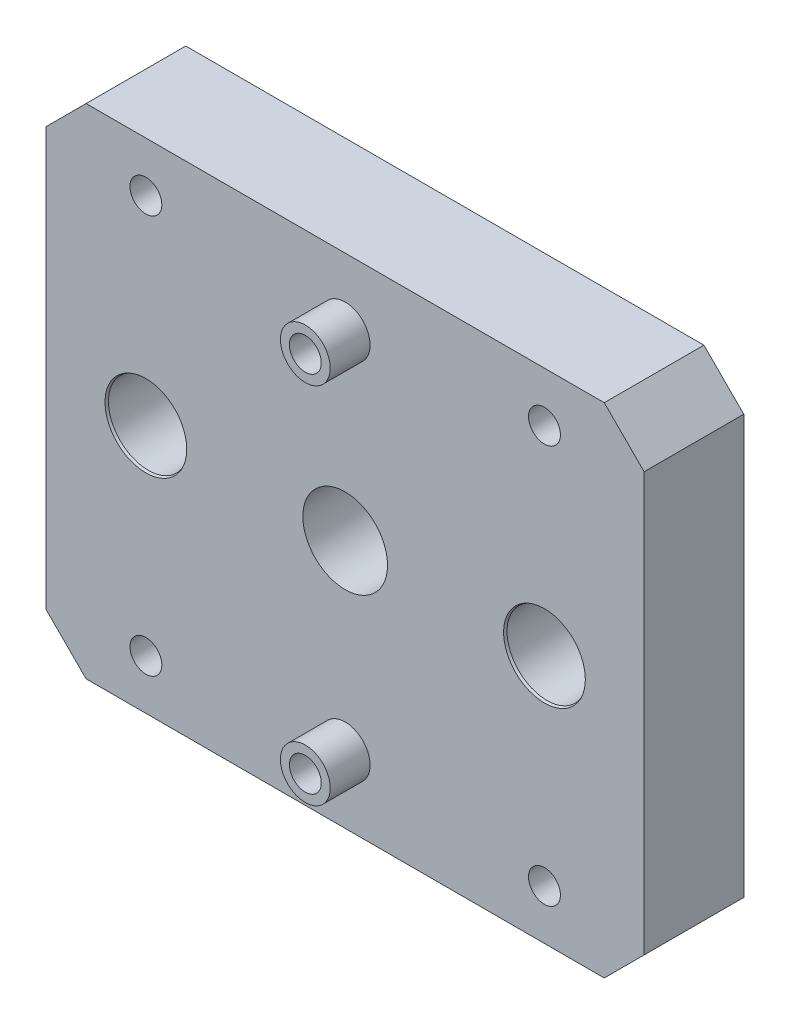
ISO-10303-21;
HEADER;
FILE_DESCRIPTION(('STEP AP214'),'2;1');
FILE_NAME('part.step','',(''),(''),'','','');
FILE_SCHEMA(('AUTOMOTIVE_DESIGN { 1 0 10303 214 1 1 1 1 }'));
ENDSEC;
DATA;
#1=APPLICATION_CONTEXT('core data for automotive mechanical design processes');
#2=APPLICATION_PROTOCOL_DEFINITION('international standard','automotive_design',2000,#1);
#3=PRODUCT_CONTEXT('',#1,'mechanical');
#4=PRODUCT('Part','Part','',(#3));
#5=PRODUCT_RELATED_PRODUCT_CATEGORY('part','',(#4));
#6=PRODUCT_DEFINITION_FORMATION('','',#4);
#7=PRODUCT_DEFINITION_CONTEXT('part definition',#1,'design');
#8=PRODUCT_DEFINITION('design','',#6,#7);
#9=PRODUCT_DEFINITION_SHAPE('','',#8);
#10=(LENGTH_UNIT() NAMED_UNIT(*) SI_UNIT(.MILLI.,.METRE.));
#11=(NAMED_UNIT(*) PLANE_ANGLE_UNIT() SI_UNIT($,.RADIAN.));
#12=(NAMED_UNIT(*) SI_UNIT($,.STERADIAN.) SOLID_ANGLE_UNIT());
#13=UNCERTAINTY_MEASURE_WITH_UNIT(LENGTH_MEASURE(1.E-05),#10,'distance_accuracy_value','');
#14=(GEOMETRIC_REPRESENTATION_CONTEXT(3) GLOBAL_UNCERTAINTY_ASSIGNED_CONTEXT((#13)) GLOBAL_UNIT_ASSIGNED_CONTEXT((#10,
#11,#12)) REPRESENTATION_CONTEXT('',''));
#15=CARTESIAN_POINT('',(0.,0.,0.));
#16=DIRECTION('',(0.,0.,1.));
#17=DIRECTION('',(1.,0.,0.));
#18=AXIS2_PLACEMENT_3D('',#15,#16,#17);
#19=CARTESIAN_POINT('',(0.,0.,10.));
#20=DIRECTION('',(0.,0.,-1.));
#21=DIRECTION('',(-1.,0.,0.));
#22=AXIS2_PLACEMENT_3D('',#19,#20,#21);
#23=PLANE('',#22);
#24=CARTESIAN_POINT('',(20.,-20.0000000000002,10.));
#25=DIRECTION('',(0.,0.,1.));
#26=DIRECTION('',(1.,0.,0.));
#27=AXIS2_PLACEMENT_3D('',#24,#25,#26);
#28=CIRCLE('',#27,1.6);
#29=CARTESIAN_POINT('',(21.6,-20.0000000000002,10.));
#30=VERTEX_POINT('',#29);
#31=EDGE_CURVE('E244',#30,#30,#28,.T.);
#32=ORIENTED_EDGE('',*,*,#31,.F.);
#33=EDGE_LOOP('',(#32));
#34=FACE_BOUND('',#33,.T.);
#35=CARTESIAN_POINT('',(-20.,20.0000000000002,10.));
#36=DIRECTION('',(0.,0.,1.));
#37=DIRECTION('',(1.,0.,0.));
#38=AXIS2_PLACEMENT_3D('',#35,#36,#37);
#39=CIRCLE('',#38,1.6);
#40=CARTESIAN_POINT('',(-18.4,20.0000000000002,10.));
#41=VERTEX_POINT('',#40);
#42=EDGE_CURVE('E229',#41,#41,#39,.T.);
#43=ORIENTED_EDGE('',*,*,#42,.F.);
#44=EDGE_LOOP('',(#43));
#45=FACE_BOUND('',#44,.T.);
#46=CARTESIAN_POINT('',(0.,-18.25,10.));
#47=DIRECTION('',(0.,0.,-1.));
#48=DIRECTION('',(-1.,0.,0.));
#49=AXIS2_PLACEMENT_3D('',#46,#47,#48);
#50=CIRCLE('',#49,2.5);
#51=CARTESIAN_POINT('',(-2.5,-18.25,10.));
#52=VERTEX_POINT('',#51);
#53=EDGE_CURVE('E149',#52,#52,#50,.F.);
#54=ORIENTED_EDGE('',*,*,#53,.F.);
#55=EDGE_LOOP('',(#54));
#56=FACE_BOUND('',#55,.T.);
#57=CARTESIAN_POINT('',(0.,18.25,10.));
#58=DIRECTION('',(0.,0.,-1.));
#59=DIRECTION('',(-1.,0.,0.));
#60=AXIS2_PLACEMENT_3D('',#57,#58,#59);
#61=CIRCLE('',#60,2.5);
#62=CARTESIAN_POINT('',(-2.5,18.25,10.));
#63=VERTEX_POINT('',#62);
#64=EDGE_CURVE('E146',#63,#63,#61,.F.);
#65=ORIENTED_EDGE('',*,*,#64,.F.);
#66=EDGE_LOOP('',(#65));
#67=FACE_BOUND('',#66,.T.);
#68=CARTESIAN_POINT('',(20.,0.,10.));
#69=DIRECTION('',(0.,0.,1.));
#70=DIRECTION('',(1.,0.,0.));
#71=AXIS2_PLACEMENT_3D('',#68,#69,#70);
#72=CIRCLE('',#71,4.1);
#73=CARTESIAN_POINT('',(24.1,0.,10.));
#74=VERTEX_POINT('',#73);
#75=EDGE_CURVE('E207',#74,#74,#72,.T.);
#76=ORIENTED_EDGE('',*,*,#75,.F.);
#77=EDGE_LOOP('',(#76));
#78=FACE_BOUND('',#77,.T.);
#79=CARTESIAN_POINT('',(-20.,0.,10.));
#80=DIRECTION('',(0.,0.,1.));
#81=DIRECTION('',(1.,0.,0.));
#82=AXIS2_PLACEMENT_3D('',#79,#80,#81);
#83=CIRCLE('',#82,4.1);
#84=CARTESIAN_POINT('',(-15.9,0.,10.));
#85=VERTEX_POINT('',#84);
#86=EDGE_CURVE('E198',#85,#85,#83,.T.);
#87=ORIENTED_EDGE('',*,*,#86,.F.);
#88=EDGE_LOOP('',(#87));
#89=FACE_BOUND('',#88,.T.);
#90=CARTESIAN_POINT('',(0.,0.,10.));
#91=DIRECTION('',(0.,0.,1.));
#92=DIRECTION('',(1.,0.,0.));
#93=AXIS2_PLACEMENT_3D('',#90,#91,#92);
#94=CIRCLE('',#93,4.25000000000002);
#95=CARTESIAN_POINT('',(4.25000000000002,0.,10.));
#96=VERTEX_POINT('',#95);
#97=EDGE_CURVE('E137',#96,#96,#94,.T.);
#98=ORIENTED_EDGE('',*,*,#97,.F.);
#99=EDGE_LOOP('',(#98));
#100=FACE_BOUND('',#99,.T.);
#101=DIRECTION('',(1.,0.,0.));
#102=VECTOR('',#101,1.);
#103=CARTESIAN_POINT('',(-30.,-25.,10.));
#104=LINE('',#103,#102);
#105=CARTESIAN_POINT('',(-26.,-25.,10.));
#106=VERTEX_POINT('',#105);
#107=CARTESIAN_POINT('',(26.,-25.,10.));
#108=VERTEX_POINT('',#107);
#109=EDGE_CURVE('E140',#106,#108,#104,.T.);
#110=ORIENTED_EDGE('',*,*,#109,.T.);
#111=DIRECTION('',(-0.707106781186549,-0.707106781186546,0.));
#112=VECTOR('',#111,1.);
#113=CARTESIAN_POINT('',(30.,-21.,10.));
#114=LINE('',#113,#112);
#115=CARTESIAN_POINT('',(30.,-21.,10.));
#116=VERTEX_POINT('',#115);
#117=EDGE_CURVE('E165',#108,#116,#114,.F.);
#118=ORIENTED_EDGE('',*,*,#117,.T.);
#119=DIRECTION('',(0.,1.,0.));
#120=VECTOR('',#119,1.);
#121=CARTESIAN_POINT('',(30.,-25.,10.));
#122=LINE('',#121,#120);
#123=CARTESIAN_POINT('',(30.,21.,10.));
#124=VERTEX_POINT('',#123);
#125=EDGE_CURVE('E123',#116,#124,#122,.T.);
#126=ORIENTED_EDGE('',*,*,#125,.T.);
#127=DIRECTION('',(0.707106781186546,-0.707106781186549,0.));
#128=VECTOR('',#127,1.);
#129=CARTESIAN_POINT('',(26.,25.,10.));
#130=LINE('',#129,#128);
#131=CARTESIAN_POINT('',(26.,25.,10.));
#132=VERTEX_POINT('',#131);
#133=EDGE_CURVE('E160',#124,#132,#130,.F.);
#134=ORIENTED_EDGE('',*,*,#133,.T.);
#135=DIRECTION('',(-1.,0.,0.));
#136=VECTOR('',#135,1.);
#137=CARTESIAN_POINT('',(-30.,25.,10.));
#138=LINE('',#137,#136);
#139=CARTESIAN_POINT('',(-26.,25.,10.));
#140=VERTEX_POINT('',#139);
#141=EDGE_CURVE('E176',#132,#140,#138,.T.);
#142=ORIENTED_EDGE('',*,*,#141,.T.);
#143=DIRECTION('',(0.707106781186549,0.707106781186546,0.));
#144=VECTOR('',#143,1.);
#145=CARTESIAN_POINT('',(-30.,21.,10.));
#146=LINE('',#145,#144);
#147=CARTESIAN_POINT('',(-30.,21.,10.));
#148=VERTEX_POINT('',#147);
#149=EDGE_CURVE('E59',#140,#148,#146,.F.);
#150=ORIENTED_EDGE('',*,*,#149,.T.);
#151=DIRECTION('',(0.,-1.,0.));
#152=VECTOR('',#151,1.);
#153=CARTESIAN_POINT('',(-30.,-25.,10.));
#154=LINE('',#153,#152);
#155=CARTESIAN_POINT('',(-30.,-21.,10.));
#156=VERTEX_POINT('',#155);
#157=EDGE_CURVE('E184',#148,#156,#154,.T.);
#158=ORIENTED_EDGE('',*,*,#157,.T.);
#159=DIRECTION('',(-0.707106781186546,0.707106781186549,0.));
#160=VECTOR('',#159,1.);
#161=CARTESIAN_POINT('',(-26.,-25.,10.));
#162=LINE('',#161,#160);
#163=EDGE_CURVE('E163',#156,#106,#162,.F.);
#164=ORIENTED_EDGE('',*,*,#163,.T.);
#165=EDGE_LOOP('',(#110,#118,#126,#134,#142,#150,#158,#164));
#166=FACE_BOUND('',#165,.T.);
#167=CARTESIAN_POINT('',(20.,20.0000000000002,10.));
#168=DIRECTION('',(0.,0.,1.));
#169=DIRECTION('',(1.,0.,0.));
#170=AXIS2_PLACEMENT_3D('',#167,#168,#169);
#171=CIRCLE('',#170,1.6);
#172=CARTESIAN_POINT('',(21.6,20.0000000000002,10.));
#173=VERTEX_POINT('',#172);
#174=EDGE_CURVE('E232',#173,#173,#171,.F.);
#175=ORIENTED_EDGE('',*,*,#174,.T.);
#176=EDGE_LOOP('',(#175));
#177=FACE_BOUND('',#176,.T.);
#178=CARTESIAN_POINT('',(-20.,-20.0000000000002,10.));
#179=DIRECTION('',(0.,0.,-1.));
#180=DIRECTION('',(-1.,0.,0.));
#181=AXIS2_PLACEMENT_3D('',#178,#179,#180);
#182=CIRCLE('',#181,1.6);
#183=CARTESIAN_POINT('',(-21.6,-20.0000000000002,10.));
#184=VERTEX_POINT('',#183);
#185=EDGE_CURVE('E238',#184,#184,#182,.T.);
#186=ORIENTED_EDGE('',*,*,#185,.T.);
#187=EDGE_LOOP('',(#186));
#188=FACE_BOUND('',#187,.T.);
#189=ADVANCED_FACE('F36',(#34,#45,#56,#67,#78,#89,#100,#166,#177,#188),#23,.F.);
#190=CARTESIAN_POINT('',(0.,0.,0.));
#191=DIRECTION('',(0.,0.,-1.));
#192=DIRECTION('',(-1.,0.,0.));
#193=AXIS2_PLACEMENT_3D('',#190,#191,#192);
#194=PLANE('',#193);
#195=CARTESIAN_POINT('',(20.,20.0000000000002,0.));
#196=DIRECTION('',(0.,0.,1.));
#197=DIRECTION('',(1.,0.,0.));
#198=AXIS2_PLACEMENT_3D('',#195,#196,#197);
#199=CIRCLE('',#198,1.6);
#200=CARTESIAN_POINT('',(21.6,20.0000000000002,0.));
#201=VERTEX_POINT('',#200);
#202=EDGE_CURVE('E247',#201,#201,#199,.F.);
#203=ORIENTED_EDGE('',*,*,#202,.F.);
#204=EDGE_LOOP('',(#203));
#205=FACE_BOUND('',#204,.T.);
#206=CARTESIAN_POINT('',(-20.,20.0000000000002,0.));
#207=DIRECTION('',(0.,0.,1.));
#208=DIRECTION('',(1.,0.,0.));
#209=AXIS2_PLACEMENT_3D('',#206,#207,#208);
#210=CIRCLE('',#209,1.6);
#211=CARTESIAN_POINT('',(-18.4,20.0000000000002,0.));
#212=VERTEX_POINT('',#211);
#213=EDGE_CURVE('E228',#212,#212,#210,.T.);
#214=ORIENTED_EDGE('',*,*,#213,.T.);
#215=EDGE_LOOP('',(#214));
#216=FACE_BOUND('',#215,.T.);
#217=CARTESIAN_POINT('',(0.,18.25,0.));
#218=DIRECTION('',(0.,0.,1.));
#219=DIRECTION('',(1.,0.,0.));
#220=AXIS2_PLACEMENT_3D('',#217,#218,#219);
#221=CIRCLE('',#220,1.60000000000001);
#222=CARTESIAN_POINT('',(1.60000000000001,18.25,0.));
#223=VERTEX_POINT('',#222);
#224=EDGE_CURVE('E222',#223,#223,#221,.T.);
#225=ORIENTED_EDGE('',*,*,#224,.T.);
#226=EDGE_LOOP('',(#225));
#227=FACE_BOUND('',#226,.T.);
#228=CARTESIAN_POINT('',(0.,-18.25,0.));
#229=DIRECTION('',(0.,0.,1.));
#230=DIRECTION('',(1.,0.,0.));
#231=AXIS2_PLACEMENT_3D('',#228,#229,#230);
#232=CIRCLE('',#231,1.60000000000001);
#233=CARTESIAN_POINT('',(1.60000000000001,-18.25,0.));
#234=VERTEX_POINT('',#233);
#235=EDGE_CURVE('E216',#234,#234,#232,.T.);
#236=ORIENTED_EDGE('',*,*,#235,.T.);
#237=EDGE_LOOP('',(#236));
#238=FACE_BOUND('',#237,.T.);
#239=CARTESIAN_POINT('',(20.,0.,0.));
#240=DIRECTION('',(0.,0.,1.));
#241=DIRECTION('',(1.,0.,0.));
#242=AXIS2_PLACEMENT_3D('',#239,#240,#241);
#243=CIRCLE('',#242,4.);
#244=CARTESIAN_POINT('',(24.,0.,0.));
#245=VERTEX_POINT('',#244);
#246=EDGE_CURVE('E201',#245,#245,#243,.T.);
#247=ORIENTED_EDGE('',*,*,#246,.T.);
#248=EDGE_LOOP('',(#247));
#249=FACE_BOUND('',#248,.T.);
#250=CARTESIAN_POINT('',(-20.,0.,0.));
#251=DIRECTION('',(0.,0.,1.));
#252=DIRECTION('',(1.,0.,0.));
#253=AXIS2_PLACEMENT_3D('',#250,#251,#252);
#254=CIRCLE('',#253,4.);
#255=CARTESIAN_POINT('',(-16.,0.,0.));
#256=VERTEX_POINT('',#255);
#257=EDGE_CURVE('E192',#256,#256,#254,.T.);
#258=ORIENTED_EDGE('',*,*,#257,.T.);
#259=EDGE_LOOP('',(#258));
#260=FACE_BOUND('',#259,.T.);
#261=CARTESIAN_POINT('',(0.,0.,0.));
#262=DIRECTION('',(0.,0.,-1.));
#263=DIRECTION('',(-1.,0.,0.));
#264=AXIS2_PLACEMENT_3D('',#261,#262,#263);
#265=CIRCLE('',#264,4.25000000000001);
#266=CARTESIAN_POINT('',(-4.25000000000001,0.,0.));
#267=VERTEX_POINT('',#266);
#268=EDGE_CURVE('E131',#267,#267,#265,.T.);
#269=ORIENTED_EDGE('',*,*,#268,.F.);
#270=EDGE_LOOP('',(#269));
#271=FACE_BOUND('',#270,.T.);
#272=DIRECTION('',(0.,1.,0.));
#273=VECTOR('',#272,1.);
#274=CARTESIAN_POINT('',(30.,-25.,0.));
#275=LINE('',#274,#273);
#276=CARTESIAN_POINT('',(30.,-21.,0.));
#277=VERTEX_POINT('',#276);
#278=CARTESIAN_POINT('',(30.,21.,0.));
#279=VERTEX_POINT('',#278);
#280=EDGE_CURVE('E120',#277,#279,#275,.T.);
#281=ORIENTED_EDGE('',*,*,#280,.F.);
#282=DIRECTION('',(0.707106781186549,0.707106781186546,0.));
#283=VECTOR('',#282,1.);
#284=CARTESIAN_POINT('',(25.4999999999999,-25.5,0.));
#285=LINE('',#284,#283);
#286=CARTESIAN_POINT('',(26.,-25.,0.));
#287=VERTEX_POINT('',#286);
#288=EDGE_CURVE('E103',#277,#287,#285,.F.);
#289=ORIENTED_EDGE('',*,*,#288,.T.);
#290=DIRECTION('',(1.,0.,0.));
#291=VECTOR('',#290,1.);
#292=CARTESIAN_POINT('',(-30.,-25.,0.));
#293=LINE('',#292,#291);
#294=CARTESIAN_POINT('',(-26.,-25.,0.));
#295=VERTEX_POINT('',#294);
#296=EDGE_CURVE('E144',#295,#287,#293,.T.);
#297=ORIENTED_EDGE('',*,*,#296,.F.);
#298=DIRECTION('',(0.707106781186546,-0.707106781186549,0.));
#299=VECTOR('',#298,1.);
#300=CARTESIAN_POINT('',(-25.5000000000001,-25.5,0.));
#301=LINE('',#300,#299);
#302=CARTESIAN_POINT('',(-30.,-21.,0.));
#303=VERTEX_POINT('',#302);
#304=EDGE_CURVE('E114',#295,#303,#301,.F.);
#305=ORIENTED_EDGE('',*,*,#304,.T.);
#306=DIRECTION('',(0.,-1.,0.));
#307=VECTOR('',#306,1.);
#308=CARTESIAN_POINT('',(-30.,-25.,0.));
#309=LINE('',#308,#307);
#310=CARTESIAN_POINT('',(-30.,21.,0.));
#311=VERTEX_POINT('',#310);
#312=EDGE_CURVE('E134',#311,#303,#309,.T.);
#313=ORIENTED_EDGE('',*,*,#312,.F.);
#314=DIRECTION('',(-0.707106781186549,-0.707106781186546,0.));
#315=VECTOR('',#314,1.);
#316=CARTESIAN_POINT('',(-25.5,25.5,0.));
#317=LINE('',#316,#315);
#318=CARTESIAN_POINT('',(-26.,25.,0.));
#319=VERTEX_POINT('',#318);
#320=EDGE_CURVE('E154',#311,#319,#317,.F.);
#321=ORIENTED_EDGE('',*,*,#320,.T.);
#322=DIRECTION('',(-1.,0.,0.));
#323=VECTOR('',#322,1.);
#324=CARTESIAN_POINT('',(-30.,25.,0.));
#325=LINE('',#324,#323);
#326=CARTESIAN_POINT('',(26.,25.,0.));
#327=VERTEX_POINT('',#326);
#328=EDGE_CURVE('E130',#327,#319,#325,.T.);
#329=ORIENTED_EDGE('',*,*,#328,.F.);
#330=DIRECTION('',(-0.707106781186546,0.707106781186549,0.));
#331=VECTOR('',#330,1.);
#332=CARTESIAN_POINT('',(25.5,25.5,0.));
#333=LINE('',#332,#331);
#334=EDGE_CURVE('E124',#327,#279,#333,.F.);
#335=ORIENTED_EDGE('',*,*,#334,.T.);
#336=EDGE_LOOP('',(#281,#289,#297,#305,#313,#321,#329,#335));
#337=FACE_BOUND('',#336,.T.);
#338=CARTESIAN_POINT('',(20.,-20.0000000000002,0.));
#339=DIRECTION('',(0.,0.,1.));
#340=DIRECTION('',(1.,0.,0.));
#341=AXIS2_PLACEMENT_3D('',#338,#339,#340);
#342=CIRCLE('',#341,1.6);
#343=CARTESIAN_POINT('',(21.6,-20.0000000000002,0.));
#344=VERTEX_POINT('',#343);
#345=EDGE_CURVE('E241',#344,#344,#342,.T.);
#346=ORIENTED_EDGE('',*,*,#345,.T.);
#347=EDGE_LOOP('',(#346));
#348=FACE_BOUND('',#347,.T.);
#349=CARTESIAN_POINT('',(-20.,-20.0000000000002,0.));
#350=DIRECTION('',(0.,0.,-1.));
#351=DIRECTION('',(-1.,0.,0.));
#352=AXIS2_PLACEMENT_3D('',#349,#350,#351);
#353=CIRCLE('',#352,1.6);
#354=CARTESIAN_POINT('',(-21.6,-20.0000000000002,0.));
#355=VERTEX_POINT('',#354);
#356=EDGE_CURVE('E235',#355,#355,#353,.T.);
#357=ORIENTED_EDGE('',*,*,#356,.F.);
#358=EDGE_LOOP('',(#357));
#359=FACE_BOUND('',#358,.T.);
#360=ADVANCED_FACE('F127',(#205,#216,#227,#238,#249,#260,#271,#337,#348,#359),#194,.T.);
#361=CARTESIAN_POINT('',(30.,-25.,10.));
#362=DIRECTION('',(-1.,0.,0.));
#363=DIRECTION('',(0.,0.,1.));
#364=AXIS2_PLACEMENT_3D('',#361,#362,#363);
#365=PLANE('',#364);
#366=ORIENTED_EDGE('',*,*,#125,.F.);
#367=DIRECTION('',(0.,0.,-1.));
#368=VECTOR('',#367,1.);
#369=CARTESIAN_POINT('',(30.,-21.,10.));
#370=LINE('',#369,#368);
#371=EDGE_CURVE('E107',#116,#277,#370,.T.);
#372=ORIENTED_EDGE('',*,*,#371,.T.);
#373=ORIENTED_EDGE('',*,*,#280,.T.);
#374=DIRECTION('',(0.,0.,1.));
#375=VECTOR('',#374,1.);
#376=CARTESIAN_POINT('',(30.,21.,10.));
#377=LINE('',#376,#375);
#378=EDGE_CURVE('E125',#279,#124,#377,.T.);
#379=ORIENTED_EDGE('',*,*,#378,.T.);
#380=EDGE_LOOP('',(#366,#372,#373,#379));
#381=FACE_BOUND('',#380,.T.);
#382=ADVANCED_FACE('F119',(#381),#365,.F.);
#383=CARTESIAN_POINT('',(-30.,25.,10.));
#384=DIRECTION('',(0.,-1.,0.));
#385=DIRECTION('',(0.,0.,-1.));
#386=AXIS2_PLACEMENT_3D('',#383,#384,#385);
#387=PLANE('',#386);
#388=ORIENTED_EDGE('',*,*,#328,.T.);
#389=DIRECTION('',(0.,0.,1.));
#390=VECTOR('',#389,1.);
#391=CARTESIAN_POINT('',(-26.,25.,10.));
#392=LINE('',#391,#390);
#393=EDGE_CURVE('E11',#319,#140,#392,.T.);
#394=ORIENTED_EDGE('',*,*,#393,.T.);
#395=ORIENTED_EDGE('',*,*,#141,.F.);
#396=DIRECTION('',(0.,0.,-1.));
#397=VECTOR('',#396,1.);
#398=CARTESIAN_POINT('',(26.,25.,10.));
#399=LINE('',#398,#397);
#400=EDGE_CURVE('E45',#132,#327,#399,.T.);
#401=ORIENTED_EDGE('',*,*,#400,.T.);
#402=EDGE_LOOP('',(#388,#394,#395,#401));
#403=FACE_BOUND('',#402,.T.);
#404=ADVANCED_FACE('F174',(#403),#387,.F.);
#405=CARTESIAN_POINT('',(-30.,-25.,10.));
#406=DIRECTION('',(1.,0.,0.));
#407=DIRECTION('',(0.,0.,-1.));
#408=AXIS2_PLACEMENT_3D('',#405,#406,#407);
#409=PLANE('',#408);
#410=ORIENTED_EDGE('',*,*,#312,.T.);
#411=DIRECTION('',(0.,0.,1.));
#412=VECTOR('',#411,1.);
#413=CARTESIAN_POINT('',(-30.,-21.,10.));
#414=LINE('',#413,#412);
#415=EDGE_CURVE('E52',#303,#156,#414,.T.);
#416=ORIENTED_EDGE('',*,*,#415,.T.);
#417=ORIENTED_EDGE('',*,*,#157,.F.);
#418=DIRECTION('',(0.,0.,-1.));
#419=VECTOR('',#418,1.);
#420=CARTESIAN_POINT('',(-30.,21.,10.));
#421=LINE('',#420,#419);
#422=EDGE_CURVE('E167',#148,#311,#421,.T.);
#423=ORIENTED_EDGE('',*,*,#422,.T.);
#424=EDGE_LOOP('',(#410,#416,#417,#423));
#425=FACE_BOUND('',#424,.T.);
#426=ADVANCED_FACE('F183',(#425),#409,.F.);
#427=CARTESIAN_POINT('',(-30.,-25.,10.));
#428=DIRECTION('',(0.,1.,0.));
#429=DIRECTION('',(0.,0.,1.));
#430=AXIS2_PLACEMENT_3D('',#427,#428,#429);
#431=PLANE('',#430);
#432=ORIENTED_EDGE('',*,*,#296,.T.);
#433=DIRECTION('',(0.,0.,1.));
#434=VECTOR('',#433,1.);
#435=CARTESIAN_POINT('',(26.,-25.,10.));
#436=LINE('',#435,#434);
#437=EDGE_CURVE('E108',#287,#108,#436,.T.);
#438=ORIENTED_EDGE('',*,*,#437,.T.);
#439=ORIENTED_EDGE('',*,*,#109,.F.);
#440=DIRECTION('',(0.,0.,-1.));
#441=VECTOR('',#440,1.);
#442=CARTESIAN_POINT('',(-26.,-25.,10.));
#443=LINE('',#442,#441);
#444=EDGE_CURVE('E113',#106,#295,#443,.T.);
#445=ORIENTED_EDGE('',*,*,#444,.T.);
#446=EDGE_LOOP('',(#432,#438,#439,#445));
#447=FACE_BOUND('',#446,.T.);
#448=ADVANCED_FACE('F284',(#447),#431,.F.);
#449=CARTESIAN_POINT('',(0.,0.,10.));
#450=DIRECTION('',(0.,0.,1.));
#451=DIRECTION('',(1.,0.,0.));
#452=AXIS2_PLACEMENT_3D('',#449,#450,#451);
#453=CYLINDRICAL_SURFACE('',#452,4.25000000000001);
#454=ORIENTED_EDGE('',*,*,#268,.T.);
#455=EDGE_LOOP('',(#454));
#456=FACE_BOUND('',#455,.T.);
#457=ORIENTED_EDGE('',*,*,#97,.T.);
#458=EDGE_LOOP('',(#457));
#459=FACE_BOUND('',#458,.T.);
#460=ADVANCED_FACE('F281',(#456,#459),#453,.F.);
#461=CARTESIAN_POINT('',(-20.,0.,10.));
#462=DIRECTION('',(0.,0.,1.));
#463=DIRECTION('',(1.,0.,0.));
#464=AXIS2_PLACEMENT_3D('',#461,#462,#463);
#465=CYLINDRICAL_SURFACE('',#464,4.00000000000001);
#466=ORIENTED_EDGE('',*,*,#257,.F.);
#467=EDGE_LOOP('',(#466));
#468=FACE_BOUND('',#467,.T.);
#469=CARTESIAN_POINT('',(-20.,0.,9.75857864376273));
#470=DIRECTION('',(0.,0.,1.));
#471=DIRECTION('',(1.,0.,0.));
#472=AXIS2_PLACEMENT_3D('',#469,#470,#471);
#473=CIRCLE('',#472,4.00000000000001);
#474=CARTESIAN_POINT('',(-16.,0.,9.75857864376273));
#475=VERTEX_POINT('',#474);
#476=EDGE_CURVE('E195',#475,#475,#473,.T.);
#477=ORIENTED_EDGE('',*,*,#476,.T.);
#478=EDGE_LOOP('',(#477));
#479=FACE_BOUND('',#478,.T.);
#480=ADVANCED_FACE('F383',(#468,#479),#465,.F.);
#481=CARTESIAN_POINT('',(-20.,0.,10.));
#482=DIRECTION('',(0.,0.,1.));
#483=DIRECTION('',(1.,0.,0.));
#484=AXIS2_PLACEMENT_3D('',#481,#482,#483);
#485=CONICAL_SURFACE('',#484,4.1,0.392699081698732);
#486=ORIENTED_EDGE('',*,*,#476,.F.);
#487=EDGE_LOOP('',(#486));
#488=FACE_BOUND('',#487,.T.);
#489=ORIENTED_EDGE('',*,*,#86,.T.);
#490=EDGE_LOOP('',(#489));
#491=FACE_BOUND('',#490,.T.);
#492=ADVANCED_FACE('F380',(#488,#491),#485,.F.);
#493=CARTESIAN_POINT('',(20.,0.,10.));
#494=DIRECTION('',(0.,0.,1.));
#495=DIRECTION('',(1.,0.,0.));
#496=AXIS2_PLACEMENT_3D('',#493,#494,#495);
#497=CYLINDRICAL_SURFACE('',#496,4.00000000000001);
#498=ORIENTED_EDGE('',*,*,#246,.F.);
#499=EDGE_LOOP('',(#498));
#500=FACE_BOUND('',#499,.T.);
#501=CARTESIAN_POINT('',(20.,0.,9.75857864376273));
#502=DIRECTION('',(0.,0.,1.));
#503=DIRECTION('',(1.,0.,0.));
#504=AXIS2_PLACEMENT_3D('',#501,#502,#503);
#505=CIRCLE('',#504,4.00000000000001);
#506=CARTESIAN_POINT('',(24.,0.,9.75857864376273));
#507=VERTEX_POINT('',#506);
#508=EDGE_CURVE('E204',#507,#507,#505,.T.);
#509=ORIENTED_EDGE('',*,*,#508,.T.);
#510=EDGE_LOOP('',(#509));
#511=FACE_BOUND('',#510,.T.);
#512=ADVANCED_FACE('F376',(#500,#511),#497,.F.);
#513=CARTESIAN_POINT('',(20.,0.,10.));
#514=DIRECTION('',(0.,0.,1.));
#515=DIRECTION('',(1.,0.,0.));
#516=AXIS2_PLACEMENT_3D('',#513,#514,#515);
#517=CONICAL_SURFACE('',#516,4.1,0.392699081698732);
#518=ORIENTED_EDGE('',*,*,#508,.F.);
#519=EDGE_LOOP('',(#518));
#520=FACE_BOUND('',#519,.T.);
#521=ORIENTED_EDGE('',*,*,#75,.T.);
#522=EDGE_LOOP('',(#521));
#523=FACE_BOUND('',#522,.T.);
#524=ADVANCED_FACE('F372',(#520,#523),#517,.F.);
#525=CARTESIAN_POINT('',(0.,18.25,14.));
#526=DIRECTION('',(0.,0.,-1.));
#527=DIRECTION('',(-1.,0.,0.));
#528=AXIS2_PLACEMENT_3D('',#525,#526,#527);
#529=CYLINDRICAL_SURFACE('',#528,2.5);
#530=CARTESIAN_POINT('',(0.,18.25,14.));
#531=DIRECTION('',(0.,0.,1.));
#532=DIRECTION('',(1.,0.,0.));
#533=AXIS2_PLACEMENT_3D('',#530,#531,#532);
#534=CIRCLE('',#533,2.5);
#535=CARTESIAN_POINT('',(2.5,18.25,14.));
#536=VERTEX_POINT('',#535);
#537=EDGE_CURVE('E210',#536,#536,#534,.T.);
#538=ORIENTED_EDGE('',*,*,#537,.F.);
#539=EDGE_LOOP('',(#538));
#540=FACE_BOUND('',#539,.T.);
#541=ORIENTED_EDGE('',*,*,#64,.T.);
#542=EDGE_LOOP('',(#541));
#543=FACE_BOUND('',#542,.T.);
#544=ADVANCED_FACE('F368',(#540,#543),#529,.T.);
#545=CARTESIAN_POINT('',(0.,18.25,14.));
#546=DIRECTION('',(0.,0.,1.));
#547=DIRECTION('',(1.,0.,0.));
#548=AXIS2_PLACEMENT_3D('',#545,#546,#547);
#549=PLANE('',#548);
#550=CARTESIAN_POINT('',(0.,18.25,14.));
#551=DIRECTION('',(0.,0.,1.));
#552=DIRECTION('',(1.,0.,0.));
#553=AXIS2_PLACEMENT_3D('',#550,#551,#552);
#554=CIRCLE('',#553,1.60000000000001);
#555=CARTESIAN_POINT('',(1.60000000000001,18.25,14.));
#556=VERTEX_POINT('',#555);
#557=EDGE_CURVE('E225',#556,#556,#554,.T.);
#558=ORIENTED_EDGE('',*,*,#557,.F.);
#559=EDGE_LOOP('',(#558));
#560=FACE_BOUND('',#559,.T.);
#561=ORIENTED_EDGE('',*,*,#537,.T.);
#562=EDGE_LOOP('',(#561));
#563=FACE_BOUND('',#562,.T.);
#564=ADVANCED_FACE('F364',(#560,#563),#549,.T.);
#565=CARTESIAN_POINT('',(0.,-18.25,14.));
#566=DIRECTION('',(0.,0.,-1.));
#567=DIRECTION('',(-1.,0.,0.));
#568=AXIS2_PLACEMENT_3D('',#565,#566,#567);
#569=CYLINDRICAL_SURFACE('',#568,2.5);
#570=CARTESIAN_POINT('',(0.,-18.25,14.));
#571=DIRECTION('',(0.,0.,1.));
#572=DIRECTION('',(1.,0.,0.));
#573=AXIS2_PLACEMENT_3D('',#570,#571,#572);
#574=CIRCLE('',#573,2.5);
#575=CARTESIAN_POINT('',(2.5,-18.25,14.));
#576=VERTEX_POINT('',#575);
#577=EDGE_CURVE('E213',#576,#576,#574,.T.);
#578=ORIENTED_EDGE('',*,*,#577,.F.);
#579=EDGE_LOOP('',(#578));
#580=FACE_BOUND('',#579,.T.);
#581=ORIENTED_EDGE('',*,*,#53,.T.);
#582=EDGE_LOOP('',(#581));
#583=FACE_BOUND('',#582,.T.);
#584=ADVANCED_FACE('F360',(#580,#583),#569,.T.);
#585=CARTESIAN_POINT('',(0.,-18.25,14.));
#586=DIRECTION('',(0.,0.,1.));
#587=DIRECTION('',(1.,0.,0.));
#588=AXIS2_PLACEMENT_3D('',#585,#586,#587);
#589=PLANE('',#588);
#590=CARTESIAN_POINT('',(0.,-18.25,14.));
#591=DIRECTION('',(0.,0.,1.));
#592=DIRECTION('',(1.,0.,0.));
#593=AXIS2_PLACEMENT_3D('',#590,#591,#592);
#594=CIRCLE('',#593,1.60000000000001);
#595=CARTESIAN_POINT('',(1.60000000000001,-18.25,14.));
#596=VERTEX_POINT('',#595);
#597=EDGE_CURVE('E219',#596,#596,#594,.T.);
#598=ORIENTED_EDGE('',*,*,#597,.F.);
#599=EDGE_LOOP('',(#598));
#600=FACE_BOUND('',#599,.T.);
#601=ORIENTED_EDGE('',*,*,#577,.T.);
#602=EDGE_LOOP('',(#601));
#603=FACE_BOUND('',#602,.T.);
#604=ADVANCED_FACE('F356',(#600,#603),#589,.T.);
#605=CARTESIAN_POINT('',(0.,-18.25,14.));
#606=DIRECTION('',(0.,0.,1.));
#607=DIRECTION('',(1.,0.,0.));
#608=AXIS2_PLACEMENT_3D('',#605,#606,#607);
#609=CYLINDRICAL_SURFACE('',#608,1.60000000000001);
#610=ORIENTED_EDGE('',*,*,#235,.F.);
#611=EDGE_LOOP('',(#610));
#612=FACE_BOUND('',#611,.T.);
#613=ORIENTED_EDGE('',*,*,#597,.T.);
#614=EDGE_LOOP('',(#613));
#615=FACE_BOUND('',#614,.T.);
#616=ADVANCED_FACE('F352',(#612,#615),#609,.F.);
#617=CARTESIAN_POINT('',(0.,18.25,14.));
#618=DIRECTION('',(0.,0.,1.));
#619=DIRECTION('',(1.,0.,0.));
#620=AXIS2_PLACEMENT_3D('',#617,#618,#619);
#621=CYLINDRICAL_SURFACE('',#620,1.60000000000001);
#622=ORIENTED_EDGE('',*,*,#224,.F.);
#623=EDGE_LOOP('',(#622));
#624=FACE_BOUND('',#623,.T.);
#625=ORIENTED_EDGE('',*,*,#557,.T.);
#626=EDGE_LOOP('',(#625));
#627=FACE_BOUND('',#626,.T.);
#628=ADVANCED_FACE('F301',(#624,#627),#621,.F.);
#629=CARTESIAN_POINT('',(30.,-21.,10.));
#630=DIRECTION('',(-0.707106781186546,0.707106781186549,0.));
#631=DIRECTION('',(0.,0.,-1.));
#632=AXIS2_PLACEMENT_3D('',#629,#630,#631);
#633=PLANE('',#632);
#634=ORIENTED_EDGE('',*,*,#117,.F.);
#635=ORIENTED_EDGE('',*,*,#437,.F.);
#636=ORIENTED_EDGE('',*,*,#288,.F.);
#637=ORIENTED_EDGE('',*,*,#371,.F.);
#638=EDGE_LOOP('',(#634,#635,#636,#637));
#639=FACE_BOUND('',#638,.T.);
#640=ADVANCED_FACE('F106',(#639),#633,.F.);
#641=CARTESIAN_POINT('',(-26.,-25.,10.));
#642=DIRECTION('',(0.707106781186549,0.707106781186546,0.));
#643=DIRECTION('',(0.,0.,-1.));
#644=AXIS2_PLACEMENT_3D('',#641,#642,#643);
#645=PLANE('',#644);
#646=ORIENTED_EDGE('',*,*,#163,.F.);
#647=ORIENTED_EDGE('',*,*,#415,.F.);
#648=ORIENTED_EDGE('',*,*,#304,.F.);
#649=ORIENTED_EDGE('',*,*,#444,.F.);
#650=EDGE_LOOP('',(#646,#647,#648,#649));
#651=FACE_BOUND('',#650,.T.);
#652=ADVANCED_FACE('F300',(#651),#645,.F.);
#653=CARTESIAN_POINT('',(-30.,21.,10.));
#654=DIRECTION('',(0.707106781186546,-0.707106781186549,0.));
#655=DIRECTION('',(0.,0.,-1.));
#656=AXIS2_PLACEMENT_3D('',#653,#654,#655);
#657=PLANE('',#656);
#658=ORIENTED_EDGE('',*,*,#149,.F.);
#659=ORIENTED_EDGE('',*,*,#393,.F.);
#660=ORIENTED_EDGE('',*,*,#320,.F.);
#661=ORIENTED_EDGE('',*,*,#422,.F.);
#662=EDGE_LOOP('',(#658,#659,#660,#661));
#663=FACE_BOUND('',#662,.T.);
#664=ADVANCED_FACE('F182',(#663),#657,.F.);
#665=CARTESIAN_POINT('',(26.,25.,10.));
#666=DIRECTION('',(-0.707106781186549,-0.707106781186546,0.));
#667=DIRECTION('',(0.,0.,-1.));
#668=AXIS2_PLACEMENT_3D('',#665,#666,#667);
#669=PLANE('',#668);
#670=ORIENTED_EDGE('',*,*,#133,.F.);
#671=ORIENTED_EDGE('',*,*,#378,.F.);
#672=ORIENTED_EDGE('',*,*,#334,.F.);
#673=ORIENTED_EDGE('',*,*,#400,.F.);
#674=EDGE_LOOP('',(#670,#671,#672,#673));
#675=FACE_BOUND('',#674,.T.);
#676=ADVANCED_FACE('F39',(#675),#669,.F.);
#677=CARTESIAN_POINT('',(-20.,20.0000000000002,0.));
#678=DIRECTION('',(0.,0.,1.));
#679=DIRECTION('',(1.,0.,0.));
#680=AXIS2_PLACEMENT_3D('',#677,#678,#679);
#681=CYLINDRICAL_SURFACE('',#680,1.6);
#682=ORIENTED_EDGE('',*,*,#213,.F.);
#683=EDGE_LOOP('',(#682));
#684=FACE_BOUND('',#683,.T.);
#685=ORIENTED_EDGE('',*,*,#42,.T.);
#686=EDGE_LOOP('',(#685));
#687=FACE_BOUND('',#686,.T.);
#688=ADVANCED_FACE('F258',(#684,#687),#681,.F.);
#689=CARTESIAN_POINT('',(20.,20.0000000000002,0.));
#690=DIRECTION('',(0.,0.,1.));
#691=DIRECTION('',(1.,0.,0.));
#692=AXIS2_PLACEMENT_3D('',#689,#690,#691);
#693=CYLINDRICAL_SURFACE('',#692,1.6);
#694=ORIENTED_EDGE('',*,*,#202,.T.);
#695=EDGE_LOOP('',(#694));
#696=FACE_BOUND('',#695,.T.);
#697=ORIENTED_EDGE('',*,*,#174,.F.);
#698=EDGE_LOOP('',(#697));
#699=FACE_BOUND('',#698,.T.);
#700=ADVANCED_FACE('F255',(#696,#699),#693,.F.);
#701=CARTESIAN_POINT('',(20.,-20.0000000000002,0.));
#702=DIRECTION('',(0.,0.,1.));
#703=DIRECTION('',(1.,0.,0.));
#704=AXIS2_PLACEMENT_3D('',#701,#702,#703);
#705=CYLINDRICAL_SURFACE('',#704,1.6);
#706=ORIENTED_EDGE('',*,*,#345,.F.);
#707=EDGE_LOOP('',(#706));
#708=FACE_BOUND('',#707,.T.);
#709=ORIENTED_EDGE('',*,*,#31,.T.);
#710=EDGE_LOOP('',(#709));
#711=FACE_BOUND('',#710,.T.);
#712=ADVANCED_FACE('F257',(#708,#711),#705,.F.);
#713=CARTESIAN_POINT('',(-20.,-20.0000000000002,0.));
#714=DIRECTION('',(0.,0.,1.));
#715=DIRECTION('',(1.,0.,0.));
#716=AXIS2_PLACEMENT_3D('',#713,#714,#715);
#717=CYLINDRICAL_SURFACE('',#716,1.6);
#718=ORIENTED_EDGE('',*,*,#356,.T.);
#719=EDGE_LOOP('',(#718));
#720=FACE_BOUND('',#719,.T.);
#721=ORIENTED_EDGE('',*,*,#185,.F.);
#722=EDGE_LOOP('',(#721));
#723=FACE_BOUND('',#722,.T.);
#724=ADVANCED_FACE('F265',(#720,#723),#717,.F.);
#725=CLOSED_SHELL('',(#189,#360,#382,#404,#426,#448,#460,#480,#492,#512,#524,#544,#564,#584,
#604,#616,#628,#640,#652,#664,#676,#688,#700,#712,#724));
#726=MANIFOLD_SOLID_BREP('B2',#725);
#727=ADVANCED_BREP_SHAPE_REPRESENTATION('',(#18,#726),#14);
#728=SHAPE_DEFINITION_REPRESENTATION(#9,#727);
ENDSEC;
END-ISO-10303-21;
